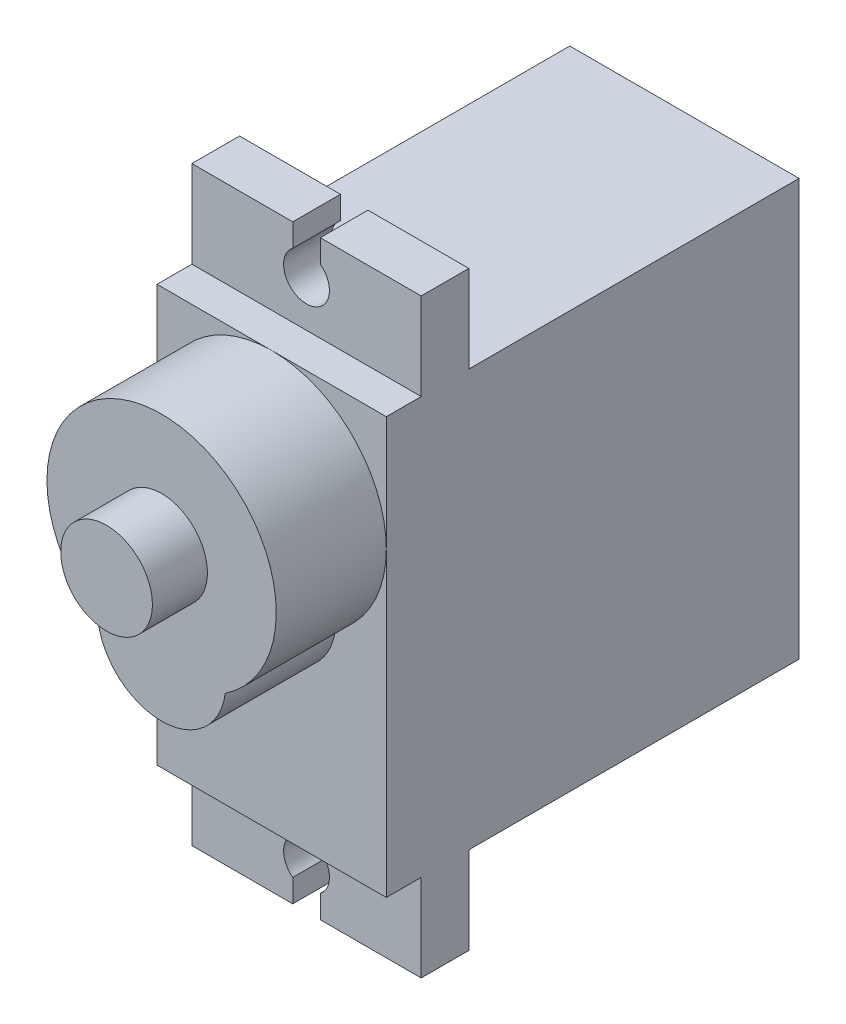
ISO-10303-21;
HEADER;
FILE_DESCRIPTION(('STEP AP214'),'2;1');
FILE_NAME('part.step','',(''),(''),'','','');
FILE_SCHEMA(('AUTOMOTIVE_DESIGN { 1 0 10303 214 1 1 1 1 }'));
ENDSEC;
DATA;
#1=APPLICATION_CONTEXT('core data for automotive mechanical design processes');
#2=APPLICATION_PROTOCOL_DEFINITION('international standard','automotive_design',2000,#1);
#3=PRODUCT_CONTEXT('',#1,'mechanical');
#4=PRODUCT('Part','Part','',(#3));
#5=PRODUCT_RELATED_PRODUCT_CATEGORY('part','',(#4));
#6=PRODUCT_DEFINITION_FORMATION('','',#4);
#7=PRODUCT_DEFINITION_CONTEXT('part definition',#1,'design');
#8=PRODUCT_DEFINITION('design','',#6,#7);
#9=PRODUCT_DEFINITION_SHAPE('','',#8);
#10=(LENGTH_UNIT() NAMED_UNIT(*) SI_UNIT(.MILLI.,.METRE.));
#11=(NAMED_UNIT(*) PLANE_ANGLE_UNIT() SI_UNIT($,.RADIAN.));
#12=(NAMED_UNIT(*) SI_UNIT($,.STERADIAN.) SOLID_ANGLE_UNIT());
#13=UNCERTAINTY_MEASURE_WITH_UNIT(LENGTH_MEASURE(1.E-05),#10,'distance_accuracy_value','');
#14=(GEOMETRIC_REPRESENTATION_CONTEXT(3) GLOBAL_UNCERTAINTY_ASSIGNED_CONTEXT((#13)) GLOBAL_UNIT_ASSIGNED_CONTEXT((#10,
#11,#12)) REPRESENTATION_CONTEXT('',''));
#15=CARTESIAN_POINT('',(0.,0.,0.));
#16=DIRECTION('',(0.,0.,1.));
#17=DIRECTION('',(1.,0.,0.));
#18=AXIS2_PLACEMENT_3D('',#15,#16,#17);
#19=CARTESIAN_POINT('',(12.5,27.45,20.6));
#20=DIRECTION('',(0.,-1.,0.));
#21=DIRECTION('',(0.,0.,-1.));
#22=AXIS2_PLACEMENT_3D('',#19,#20,#21);
#23=PLANE('',#22);
#24=DIRECTION('',(-1.,0.,0.));
#25=VECTOR('',#24,1.);
#26=CARTESIAN_POINT('',(12.5,27.45,20.6));
#27=LINE('',#26,#25);
#28=CARTESIAN_POINT('',(5.5,27.45,20.6));
#29=VERTEX_POINT('',#28);
#30=CARTESIAN_POINT('',(0.,27.45,20.6));
#31=VERTEX_POINT('',#30);
#32=EDGE_CURVE('E369',#29,#31,#27,.T.);
#33=ORIENTED_EDGE('',*,*,#32,.F.);
#34=DIRECTION('',(0.,0.,1.));
#35=VECTOR('',#34,1.);
#36=CARTESIAN_POINT('',(5.5,27.45,13.6988373664787));
#37=LINE('',#36,#35);
#38=CARTESIAN_POINT('',(5.5,27.45,18.));
#39=VERTEX_POINT('',#38);
#40=EDGE_CURVE('E234',#39,#29,#37,.T.);
#41=ORIENTED_EDGE('',*,*,#40,.F.);
#42=DIRECTION('',(-1.,0.,0.));
#43=VECTOR('',#42,1.);
#44=CARTESIAN_POINT('',(12.5,27.45,18.));
#45=LINE('',#44,#43);
#46=CARTESIAN_POINT('',(0.,27.45,18.));
#47=VERTEX_POINT('',#46);
#48=EDGE_CURVE('E371',#39,#47,#45,.T.);
#49=ORIENTED_EDGE('',*,*,#48,.T.);
#50=DIRECTION('',(0.,0.,1.));
#51=VECTOR('',#50,1.);
#52=CARTESIAN_POINT('',(0.,27.45,20.6));
#53=LINE('',#52,#51);
#54=EDGE_CURVE('E319',#47,#31,#53,.T.);
#55=ORIENTED_EDGE('',*,*,#54,.T.);
#56=EDGE_LOOP('',(#33,#41,#49,#55));
#57=FACE_BOUND('',#56,.T.);
#58=ADVANCED_FACE('F50',(#57),#23,.F.);
#59=CARTESIAN_POINT('',(12.5,-4.75,20.6));
#60=DIRECTION('',(0.,0.,-1.));
#61=DIRECTION('',(-1.,0.,0.));
#62=AXIS2_PLACEMENT_3D('',#59,#60,#61);
#63=PLANE('',#62);
#64=DIRECTION('',(0.,-1.,0.));
#65=VECTOR('',#64,1.);
#66=CARTESIAN_POINT('',(7.,0.,20.6));
#67=LINE('',#66,#65);
#68=CARTESIAN_POINT('',(7.,-3.5,20.6));
#69=VERTEX_POINT('',#68);
#70=CARTESIAN_POINT('',(7.,-4.75,20.6));
#71=VERTEX_POINT('',#70);
#72=EDGE_CURVE('E248',#69,#71,#67,.T.);
#73=ORIENTED_EDGE('',*,*,#72,.T.);
#74=DIRECTION('',(-1.,0.,0.));
#75=VECTOR('',#74,1.);
#76=CARTESIAN_POINT('',(12.5,-4.75,20.6));
#77=LINE('',#76,#75);
#78=CARTESIAN_POINT('',(12.5,-4.75,20.6));
#79=VERTEX_POINT('',#78);
#80=EDGE_CURVE('E352',#79,#71,#77,.T.);
#81=ORIENTED_EDGE('',*,*,#80,.F.);
#82=DIRECTION('',(0.,-1.,0.));
#83=VECTOR('',#82,1.);
#84=CARTESIAN_POINT('',(12.5,-4.75,20.6));
#85=LINE('',#84,#83);
#86=CARTESIAN_POINT('',(12.5,0.,20.6));
#87=VERTEX_POINT('',#86);
#88=EDGE_CURVE('E304',#87,#79,#85,.T.);
#89=ORIENTED_EDGE('',*,*,#88,.F.);
#90=DIRECTION('',(-1.,0.,0.));
#91=VECTOR('',#90,1.);
#92=CARTESIAN_POINT('',(12.5,0.,20.6));
#93=LINE('',#92,#91);
#94=CARTESIAN_POINT('',(0.,0.,20.6));
#95=VERTEX_POINT('',#94);
#96=EDGE_CURVE('E357',#87,#95,#93,.T.);
#97=ORIENTED_EDGE('',*,*,#96,.T.);
#98=DIRECTION('',(0.,-1.,0.));
#99=VECTOR('',#98,1.);
#100=CARTESIAN_POINT('',(0.,-4.75,20.6));
#101=LINE('',#100,#99);
#102=CARTESIAN_POINT('',(0.,-4.75,20.6));
#103=VERTEX_POINT('',#102);
#104=EDGE_CURVE('E331',#95,#103,#101,.T.);
#105=ORIENTED_EDGE('',*,*,#104,.T.);
#106=CARTESIAN_POINT('',(5.5,-4.75,20.6));
#107=VERTEX_POINT('',#106);
#108=EDGE_CURVE('E355',#107,#103,#77,.T.);
#109=ORIENTED_EDGE('',*,*,#108,.F.);
#110=DIRECTION('',(0.,-1.,0.));
#111=VECTOR('',#110,1.);
#112=CARTESIAN_POINT('',(5.5,0.,20.6));
#113=LINE('',#112,#111);
#114=CARTESIAN_POINT('',(5.5,-3.5,20.6));
#115=VERTEX_POINT('',#114);
#116=EDGE_CURVE('E251',#115,#107,#113,.T.);
#117=ORIENTED_EDGE('',*,*,#116,.F.);
#118=CARTESIAN_POINT('',(6.25,-2.5,20.6));
#119=DIRECTION('',(0.,0.,1.));
#120=DIRECTION('',(1.,0.,0.));
#121=AXIS2_PLACEMENT_3D('',#118,#119,#120);
#122=CIRCLE('',#121,1.25);
#123=EDGE_CURVE('E253',#69,#115,#122,.T.);
#124=ORIENTED_EDGE('',*,*,#123,.F.);
#125=EDGE_LOOP('',(#73,#81,#89,#97,#105,#109,#117,#124));
#126=FACE_BOUND('',#125,.T.);
#127=ADVANCED_FACE('F422',(#126),#63,.F.);
#128=CARTESIAN_POINT('',(12.5,-4.75,18.));
#129=DIRECTION('',(0.,1.,0.));
#130=DIRECTION('',(0.,0.,1.));
#131=AXIS2_PLACEMENT_3D('',#128,#129,#130);
#132=PLANE('',#131);
#133=DIRECTION('',(0.,0.,1.));
#134=VECTOR('',#133,1.);
#135=CARTESIAN_POINT('',(7.,-4.75,13.6988373664787));
#136=LINE('',#135,#134);
#137=CARTESIAN_POINT('',(7.,-4.75,18.));
#138=VERTEX_POINT('',#137);
#139=EDGE_CURVE('E243',#138,#71,#136,.T.);
#140=ORIENTED_EDGE('',*,*,#139,.F.);
#141=DIRECTION('',(-1.,0.,0.));
#142=VECTOR('',#141,1.);
#143=CARTESIAN_POINT('',(12.5,-4.75,18.));
#144=LINE('',#143,#142);
#145=CARTESIAN_POINT('',(12.5,-4.75,18.));
#146=VERTEX_POINT('',#145);
#147=EDGE_CURVE('E349',#146,#138,#144,.T.);
#148=ORIENTED_EDGE('',*,*,#147,.F.);
#149=DIRECTION('',(0.,0.,-1.));
#150=VECTOR('',#149,1.);
#151=CARTESIAN_POINT('',(12.5,-4.75,18.));
#152=LINE('',#151,#150);
#153=EDGE_CURVE('E308',#79,#146,#152,.T.);
#154=ORIENTED_EDGE('',*,*,#153,.F.);
#155=ORIENTED_EDGE('',*,*,#80,.T.);
#156=EDGE_LOOP('',(#140,#148,#154,#155));
#157=FACE_BOUND('',#156,.T.);
#158=ADVANCED_FACE('F429',(#157),#132,.F.);
#159=CARTESIAN_POINT('',(12.5,0.,18.));
#160=DIRECTION('',(0.,0.,1.));
#161=DIRECTION('',(0.,-1.,0.));
#162=AXIS2_PLACEMENT_3D('',#159,#160,#161);
#163=PLANE('',#162);
#164=DIRECTION('',(0.,1.,0.));
#165=VECTOR('',#164,1.);
#166=CARTESIAN_POINT('',(7.,0.,18.));
#167=LINE('',#166,#165);
#168=CARTESIAN_POINT('',(7.,-3.5,18.));
#169=VERTEX_POINT('',#168);
#170=EDGE_CURVE('E242',#138,#169,#167,.T.);
#171=ORIENTED_EDGE('',*,*,#170,.T.);
#172=CARTESIAN_POINT('',(6.25,-2.5,18.));
#173=DIRECTION('',(0.,0.,1.));
#174=DIRECTION('',(1.,0.,0.));
#175=AXIS2_PLACEMENT_3D('',#172,#173,#174);
#176=CIRCLE('',#175,1.25);
#177=CARTESIAN_POINT('',(5.5,-3.5,18.));
#178=VERTEX_POINT('',#177);
#179=EDGE_CURVE('E250',#178,#169,#176,.F.);
#180=ORIENTED_EDGE('',*,*,#179,.F.);
#181=DIRECTION('',(0.,1.,0.));
#182=VECTOR('',#181,1.);
#183=CARTESIAN_POINT('',(5.5,0.,18.));
#184=LINE('',#183,#182);
#185=CARTESIAN_POINT('',(5.5,-4.75,18.));
#186=VERTEX_POINT('',#185);
#187=EDGE_CURVE('E241',#186,#178,#184,.T.);
#188=ORIENTED_EDGE('',*,*,#187,.F.);
#189=CARTESIAN_POINT('',(0.,-4.75,18.));
#190=VERTEX_POINT('',#189);
#191=EDGE_CURVE('E346',#186,#190,#144,.T.);
#192=ORIENTED_EDGE('',*,*,#191,.T.);
#193=DIRECTION('',(0.,1.,0.));
#194=VECTOR('',#193,1.);
#195=CARTESIAN_POINT('',(0.,0.,18.));
#196=LINE('',#195,#194);
#197=CARTESIAN_POINT('',(0.,0.,18.));
#198=VERTEX_POINT('',#197);
#199=EDGE_CURVE('E339',#190,#198,#196,.T.);
#200=ORIENTED_EDGE('',*,*,#199,.T.);
#201=DIRECTION('',(-1.,0.,0.));
#202=VECTOR('',#201,1.);
#203=CARTESIAN_POINT('',(12.5,0.,18.));
#204=LINE('',#203,#202);
#205=CARTESIAN_POINT('',(12.5,0.,18.));
#206=VERTEX_POINT('',#205);
#207=EDGE_CURVE('E341',#206,#198,#204,.T.);
#208=ORIENTED_EDGE('',*,*,#207,.F.);
#209=DIRECTION('',(0.,1.,0.));
#210=VECTOR('',#209,1.);
#211=CARTESIAN_POINT('',(12.5,0.,18.));
#212=LINE('',#211,#210);
#213=EDGE_CURVE('E306',#146,#206,#212,.T.);
#214=ORIENTED_EDGE('',*,*,#213,.F.);
#215=ORIENTED_EDGE('',*,*,#147,.T.);
#216=EDGE_LOOP('',(#171,#180,#188,#192,#200,#208,#214,#215));
#217=FACE_BOUND('',#216,.T.);
#218=ADVANCED_FACE('F432',(#217),#163,.F.);
#219=CARTESIAN_POINT('',(12.5,0.,22.5));
#220=DIRECTION('',(0.,0.,-1.));
#221=DIRECTION('',(-1.,0.,0.));
#222=AXIS2_PLACEMENT_3D('',#219,#220,#221);
#223=PLANE('',#222);
#224=CARTESIAN_POINT('',(6.25,11.7,22.5));
#225=DIRECTION('',(0.,0.,1.));
#226=DIRECTION('',(1.,0.,0.));
#227=AXIS2_PLACEMENT_3D('',#224,#225,#226);
#228=CIRCLE('',#227,3.5);
#229=CARTESIAN_POINT('',(2.77870895834923,11.2526315789474,22.5));
#230=VERTEX_POINT('',#229);
#231=CARTESIAN_POINT('',(9.72129104165077,11.2526315789474,22.5));
#232=VERTEX_POINT('',#231);
#233=EDGE_CURVE('E262',#230,#232,#228,.T.);
#234=ORIENTED_EDGE('',*,*,#233,.F.);
#235=CARTESIAN_POINT('',(6.25,16.45,22.5));
#236=DIRECTION('',(0.,0.,1.));
#237=DIRECTION('',(1.,0.,0.));
#238=AXIS2_PLACEMENT_3D('',#235,#236,#237);
#239=CIRCLE('',#238,6.25);
#240=CARTESIAN_POINT('',(0.,16.45,22.5));
#241=VERTEX_POINT('',#240);
#242=EDGE_CURVE('E280',#241,#230,#239,.T.);
#243=ORIENTED_EDGE('',*,*,#242,.F.);
#244=DIRECTION('',(0.,-1.,0.));
#245=VECTOR('',#244,1.);
#246=CARTESIAN_POINT('',(0.,0.,22.5));
#247=LINE('',#246,#245);
#248=CARTESIAN_POINT('',(0.,0.,22.5));
#249=VERTEX_POINT('',#248);
#250=EDGE_CURVE('E327',#241,#249,#247,.T.);
#251=ORIENTED_EDGE('',*,*,#250,.T.);
#252=DIRECTION('',(-1.,0.,0.));
#253=VECTOR('',#252,1.);
#254=CARTESIAN_POINT('',(12.5,0.,22.5));
#255=LINE('',#254,#253);
#256=CARTESIAN_POINT('',(12.5,0.,22.5));
#257=VERTEX_POINT('',#256);
#258=EDGE_CURVE('E359',#257,#249,#255,.T.);
#259=ORIENTED_EDGE('',*,*,#258,.F.);
#260=DIRECTION('',(0.,-1.,0.));
#261=VECTOR('',#260,1.);
#262=CARTESIAN_POINT('',(12.5,0.,22.5));
#263=LINE('',#262,#261);
#264=CARTESIAN_POINT('',(12.5,16.45,22.5));
#265=VERTEX_POINT('',#264);
#266=EDGE_CURVE('E297',#265,#257,#263,.T.);
#267=ORIENTED_EDGE('',*,*,#266,.F.);
#268=EDGE_CURVE('E269',#232,#265,#239,.T.);
#269=ORIENTED_EDGE('',*,*,#268,.F.);
#270=EDGE_LOOP('',(#234,#243,#251,#259,#267,#269));
#271=FACE_BOUND('',#270,.T.);
#272=ADVANCED_FACE('F400',(#271),#223,.F.);
#273=CARTESIAN_POINT('',(6.25,22.7,22.5));
#274=VERTEX_POINT('',#273);
#275=EDGE_CURVE('E57',#265,#274,#239,.T.);
#276=ORIENTED_EDGE('',*,*,#275,.F.);
#277=CARTESIAN_POINT('',(12.5,22.7,22.5));
#278=VERTEX_POINT('',#277);
#279=EDGE_CURVE('E298',#278,#265,#263,.T.);
#280=ORIENTED_EDGE('',*,*,#279,.F.);
#281=DIRECTION('',(-1.,0.,0.));
#282=VECTOR('',#281,1.);
#283=CARTESIAN_POINT('',(12.5,22.7,22.5));
#284=LINE('',#283,#282);
#285=EDGE_CURVE('E361',#278,#274,#284,.T.);
#286=ORIENTED_EDGE('',*,*,#285,.T.);
#287=EDGE_LOOP('',(#276,#280,#286));
#288=FACE_BOUND('',#287,.T.);
#289=ADVANCED_FACE('F392',(#288),#223,.F.);
#290=CARTESIAN_POINT('',(12.5,22.7,0.));
#291=DIRECTION('',(0.,0.,1.));
#292=DIRECTION('',(1.,0.,0.));
#293=AXIS2_PLACEMENT_3D('',#290,#291,#292);
#294=PLANE('',#293);
#295=DIRECTION('',(0.,1.,0.));
#296=VECTOR('',#295,1.);
#297=CARTESIAN_POINT('',(0.,22.7,0.));
#298=LINE('',#297,#296);
#299=CARTESIAN_POINT('',(0.,0.,0.));
#300=VERTEX_POINT('',#299);
#301=CARTESIAN_POINT('',(0.,22.7,0.));
#302=VERTEX_POINT('',#301);
#303=EDGE_CURVE('E282',#300,#302,#298,.T.);
#304=ORIENTED_EDGE('',*,*,#303,.T.);
#305=DIRECTION('',(-1.,0.,0.));
#306=VECTOR('',#305,1.);
#307=CARTESIAN_POINT('',(12.5,22.7,0.));
#308=LINE('',#307,#306);
#309=CARTESIAN_POINT('',(12.5,22.7,0.));
#310=VERTEX_POINT('',#309);
#311=EDGE_CURVE('E51',#310,#302,#308,.T.);
#312=ORIENTED_EDGE('',*,*,#311,.F.);
#313=DIRECTION('',(0.,1.,0.));
#314=VECTOR('',#313,1.);
#315=CARTESIAN_POINT('',(12.5,22.7,0.));
#316=LINE('',#315,#314);
#317=CARTESIAN_POINT('',(12.5,0.,0.));
#318=VERTEX_POINT('',#317);
#319=EDGE_CURVE('E283',#318,#310,#316,.T.);
#320=ORIENTED_EDGE('',*,*,#319,.F.);
#321=DIRECTION('',(-1.,0.,0.));
#322=VECTOR('',#321,1.);
#323=CARTESIAN_POINT('',(12.5,0.,0.));
#324=LINE('',#323,#322);
#325=EDGE_CURVE('E315',#318,#300,#324,.T.);
#326=ORIENTED_EDGE('',*,*,#325,.T.);
#327=EDGE_LOOP('',(#304,#312,#320,#326));
#328=FACE_BOUND('',#327,.T.);
#329=ADVANCED_FACE('F47',(#328),#294,.F.);
#330=CARTESIAN_POINT('',(12.5,22.7,18.));
#331=DIRECTION('',(0.,-1.,0.));
#332=DIRECTION('',(0.,0.,-1.));
#333=AXIS2_PLACEMENT_3D('',#330,#331,#332);
#334=PLANE('',#333);
#335=DIRECTION('',(0.,0.,1.));
#336=VECTOR('',#335,1.);
#337=CARTESIAN_POINT('',(0.,22.7,18.));
#338=LINE('',#337,#336);
#339=CARTESIAN_POINT('',(0.,22.7,18.));
#340=VERTEX_POINT('',#339);
#341=EDGE_CURVE('E312',#302,#340,#338,.T.);
#342=ORIENTED_EDGE('',*,*,#341,.T.);
#343=DIRECTION('',(-1.,0.,0.));
#344=VECTOR('',#343,1.);
#345=CARTESIAN_POINT('',(12.5,22.7,18.));
#346=LINE('',#345,#344);
#347=CARTESIAN_POINT('',(12.5,22.7,18.));
#348=VERTEX_POINT('',#347);
#349=EDGE_CURVE('E372',#348,#340,#346,.T.);
#350=ORIENTED_EDGE('',*,*,#349,.F.);
#351=DIRECTION('',(0.,0.,1.));
#352=VECTOR('',#351,1.);
#353=CARTESIAN_POINT('',(12.5,22.7,18.));
#354=LINE('',#353,#352);
#355=EDGE_CURVE('E290',#310,#348,#354,.T.);
#356=ORIENTED_EDGE('',*,*,#355,.F.);
#357=ORIENTED_EDGE('',*,*,#311,.T.);
#358=EDGE_LOOP('',(#342,#350,#356,#357));
#359=FACE_BOUND('',#358,.T.);
#360=ADVANCED_FACE('F441',(#359),#334,.F.);
#361=CARTESIAN_POINT('',(12.5,27.45,18.));
#362=DIRECTION('',(0.,0.,1.));
#363=DIRECTION('',(1.,0.,0.));
#364=AXIS2_PLACEMENT_3D('',#361,#362,#363);
#365=PLANE('',#364);
#366=ORIENTED_EDGE('',*,*,#48,.F.);
#367=DIRECTION('',(0.,1.,0.));
#368=VECTOR('',#367,1.);
#369=CARTESIAN_POINT('',(5.5,0.,18.));
#370=LINE('',#369,#368);
#371=CARTESIAN_POINT('',(5.5,26.2,18.));
#372=VERTEX_POINT('',#371);
#373=EDGE_CURVE('E238',#372,#39,#370,.T.);
#374=ORIENTED_EDGE('',*,*,#373,.F.);
#375=CARTESIAN_POINT('',(6.25,25.2,18.));
#376=DIRECTION('',(0.,0.,1.));
#377=DIRECTION('',(1.,0.,0.));
#378=AXIS2_PLACEMENT_3D('',#375,#376,#377);
#379=CIRCLE('',#378,1.25);
#380=CARTESIAN_POINT('',(7.,26.2,18.));
#381=VERTEX_POINT('',#380);
#382=EDGE_CURVE('E240',#381,#372,#379,.F.);
#383=ORIENTED_EDGE('',*,*,#382,.F.);
#384=DIRECTION('',(0.,-1.,0.));
#385=VECTOR('',#384,1.);
#386=CARTESIAN_POINT('',(6.99999999999998,0.,18.));
#387=LINE('',#386,#385);
#388=CARTESIAN_POINT('',(7.,27.45,18.));
#389=VERTEX_POINT('',#388);
#390=EDGE_CURVE('E212',#389,#381,#387,.T.);
#391=ORIENTED_EDGE('',*,*,#390,.F.);
#392=CARTESIAN_POINT('',(12.5,27.45,18.));
#393=VERTEX_POINT('',#392);
#394=EDGE_CURVE('E375',#393,#389,#45,.T.);
#395=ORIENTED_EDGE('',*,*,#394,.F.);
#396=DIRECTION('',(0.,1.,0.));
#397=VECTOR('',#396,1.);
#398=CARTESIAN_POINT('',(12.5,27.45,18.));
#399=LINE('',#398,#397);
#400=EDGE_CURVE('E286',#348,#393,#399,.T.);
#401=ORIENTED_EDGE('',*,*,#400,.F.);
#402=ORIENTED_EDGE('',*,*,#349,.T.);
#403=DIRECTION('',(0.,1.,0.));
#404=VECTOR('',#403,1.);
#405=CARTESIAN_POINT('',(0.,27.45,18.));
#406=LINE('',#405,#404);
#407=EDGE_CURVE('E320',#340,#47,#406,.T.);
#408=ORIENTED_EDGE('',*,*,#407,.T.);
#409=EDGE_LOOP('',(#366,#374,#383,#391,#395,#401,#402,#408));
#410=FACE_BOUND('',#409,.T.);
#411=ADVANCED_FACE('F450',(#410),#365,.F.);
#412=ORIENTED_EDGE('',*,*,#394,.T.);
#413=DIRECTION('',(0.,0.,1.));
#414=VECTOR('',#413,1.);
#415=CARTESIAN_POINT('',(7.,27.45,13.6988373664787));
#416=LINE('',#415,#414);
#417=CARTESIAN_POINT('',(7.,27.45,20.6));
#418=VERTEX_POINT('',#417);
#419=EDGE_CURVE('E220',#389,#418,#416,.T.);
#420=ORIENTED_EDGE('',*,*,#419,.T.);
#421=CARTESIAN_POINT('',(12.5,27.45,20.6));
#422=VERTEX_POINT('',#421);
#423=EDGE_CURVE('E228',#422,#418,#27,.T.);
#424=ORIENTED_EDGE('',*,*,#423,.F.);
#425=DIRECTION('',(0.,0.,1.));
#426=VECTOR('',#425,1.);
#427=CARTESIAN_POINT('',(12.5,27.45,20.6));
#428=LINE('',#427,#426);
#429=EDGE_CURVE('E295',#393,#422,#428,.T.);
#430=ORIENTED_EDGE('',*,*,#429,.F.);
#431=EDGE_LOOP('',(#412,#420,#424,#430));
#432=FACE_BOUND('',#431,.T.);
#433=ADVANCED_FACE('F449',(#432),#23,.F.);
#434=CARTESIAN_POINT('',(12.5,22.7,20.6));
#435=DIRECTION('',(0.,0.,-1.));
#436=DIRECTION('',(-1.,0.,0.));
#437=AXIS2_PLACEMENT_3D('',#434,#435,#436);
#438=PLANE('',#437);
#439=CARTESIAN_POINT('',(6.25,25.2,20.6));
#440=DIRECTION('',(0.,0.,1.));
#441=DIRECTION('',(1.,0.,0.));
#442=AXIS2_PLACEMENT_3D('',#439,#440,#441);
#443=CIRCLE('',#442,1.25);
#444=CARTESIAN_POINT('',(5.5,26.2,20.6));
#445=VERTEX_POINT('',#444);
#446=CARTESIAN_POINT('',(7.,26.2,20.6));
#447=VERTEX_POINT('',#446);
#448=EDGE_CURVE('E222',#445,#447,#443,.T.);
#449=ORIENTED_EDGE('',*,*,#448,.F.);
#450=DIRECTION('',(0.,-1.,0.));
#451=VECTOR('',#450,1.);
#452=CARTESIAN_POINT('',(5.5,0.,20.6));
#453=LINE('',#452,#451);
#454=EDGE_CURVE('E63',#29,#445,#453,.T.);
#455=ORIENTED_EDGE('',*,*,#454,.F.);
#456=ORIENTED_EDGE('',*,*,#32,.T.);
#457=DIRECTION('',(0.,-1.,0.));
#458=VECTOR('',#457,1.);
#459=CARTESIAN_POINT('',(0.,22.7,20.6));
#460=LINE('',#459,#458);
#461=CARTESIAN_POINT('',(0.,22.7,20.6));
#462=VERTEX_POINT('',#461);
#463=EDGE_CURVE('E323',#31,#462,#460,.T.);
#464=ORIENTED_EDGE('',*,*,#463,.T.);
#465=DIRECTION('',(-1.,0.,0.));
#466=VECTOR('',#465,1.);
#467=CARTESIAN_POINT('',(12.5,22.7,20.6));
#468=LINE('',#467,#466);
#469=CARTESIAN_POINT('',(12.5,22.7,20.6));
#470=VERTEX_POINT('',#469);
#471=EDGE_CURVE('E368',#470,#462,#468,.T.);
#472=ORIENTED_EDGE('',*,*,#471,.F.);
#473=DIRECTION('',(0.,-1.,0.));
#474=VECTOR('',#473,1.);
#475=CARTESIAN_POINT('',(12.5,22.7,20.6));
#476=LINE('',#475,#474);
#477=EDGE_CURVE('E294',#422,#470,#476,.T.);
#478=ORIENTED_EDGE('',*,*,#477,.F.);
#479=ORIENTED_EDGE('',*,*,#423,.T.);
#480=DIRECTION('',(0.,1.,0.));
#481=VECTOR('',#480,1.);
#482=CARTESIAN_POINT('',(6.99999999999998,0.,20.6));
#483=LINE('',#482,#481);
#484=EDGE_CURVE('E211',#447,#418,#483,.T.);
#485=ORIENTED_EDGE('',*,*,#484,.F.);
#486=EDGE_LOOP('',(#449,#455,#456,#464,#472,#478,#479,#485));
#487=FACE_BOUND('',#486,.T.);
#488=ADVANCED_FACE('F226',(#487),#438,.F.);
#489=CARTESIAN_POINT('',(12.5,22.7,22.5));
#490=DIRECTION('',(0.,-1.,0.));
#491=DIRECTION('',(0.,0.,-1.));
#492=AXIS2_PLACEMENT_3D('',#489,#490,#491);
#493=PLANE('',#492);
#494=DIRECTION('',(0.,0.,1.));
#495=VECTOR('',#494,1.);
#496=CARTESIAN_POINT('',(0.,22.7,22.5));
#497=LINE('',#496,#495);
#498=CARTESIAN_POINT('',(0.,22.7,22.5));
#499=VERTEX_POINT('',#498);
#500=EDGE_CURVE('E324',#462,#499,#497,.T.);
#501=ORIENTED_EDGE('',*,*,#500,.T.);
#502=EDGE_CURVE('E362',#274,#499,#284,.T.);
#503=ORIENTED_EDGE('',*,*,#502,.F.);
#504=ORIENTED_EDGE('',*,*,#285,.F.);
#505=DIRECTION('',(0.,0.,1.));
#506=VECTOR('',#505,1.);
#507=CARTESIAN_POINT('',(12.5,22.7,22.5));
#508=LINE('',#507,#506);
#509=EDGE_CURVE('E296',#470,#278,#508,.T.);
#510=ORIENTED_EDGE('',*,*,#509,.F.);
#511=ORIENTED_EDGE('',*,*,#471,.T.);
#512=EDGE_LOOP('',(#501,#503,#504,#510,#511));
#513=FACE_BOUND('',#512,.T.);
#514=ADVANCED_FACE('F403',(#513),#493,.F.);
#515=EDGE_CURVE('E383',#274,#241,#239,.T.);
#516=ORIENTED_EDGE('',*,*,#515,.F.);
#517=ORIENTED_EDGE('',*,*,#502,.T.);
#518=EDGE_CURVE('E328',#499,#241,#247,.T.);
#519=ORIENTED_EDGE('',*,*,#518,.T.);
#520=EDGE_LOOP('',(#516,#517,#519));
#521=FACE_BOUND('',#520,.T.);
#522=ADVANCED_FACE('F408',(#521),#223,.F.);
#523=CARTESIAN_POINT('',(12.5,0.,20.6));
#524=DIRECTION('',(0.,1.,0.));
#525=DIRECTION('',(0.,0.,1.));
#526=AXIS2_PLACEMENT_3D('',#523,#524,#525);
#527=PLANE('',#526);
#528=DIRECTION('',(0.,0.,-1.));
#529=VECTOR('',#528,1.);
#530=CARTESIAN_POINT('',(0.,0.,20.6));
#531=LINE('',#530,#529);
#532=EDGE_CURVE('E335',#249,#95,#531,.T.);
#533=ORIENTED_EDGE('',*,*,#532,.T.);
#534=ORIENTED_EDGE('',*,*,#96,.F.);
#535=DIRECTION('',(0.,0.,-1.));
#536=VECTOR('',#535,1.);
#537=CARTESIAN_POINT('',(12.5,0.,20.6));
#538=LINE('',#537,#536);
#539=EDGE_CURVE('E305',#257,#87,#538,.T.);
#540=ORIENTED_EDGE('',*,*,#539,.F.);
#541=ORIENTED_EDGE('',*,*,#258,.T.);
#542=EDGE_LOOP('',(#533,#534,#540,#541));
#543=FACE_BOUND('',#542,.T.);
#544=ADVANCED_FACE('F416',(#543),#527,.F.);
#545=ORIENTED_EDGE('',*,*,#191,.F.);
#546=DIRECTION('',(0.,0.,1.));
#547=VECTOR('',#546,1.);
#548=CARTESIAN_POINT('',(5.5,-4.75,13.6988373664787));
#549=LINE('',#548,#547);
#550=EDGE_CURVE('E260',#186,#107,#549,.T.);
#551=ORIENTED_EDGE('',*,*,#550,.T.);
#552=ORIENTED_EDGE('',*,*,#108,.T.);
#553=DIRECTION('',(0.,0.,-1.));
#554=VECTOR('',#553,1.);
#555=CARTESIAN_POINT('',(0.,-4.75,18.));
#556=LINE('',#555,#554);
#557=EDGE_CURVE('E340',#103,#190,#556,.T.);
#558=ORIENTED_EDGE('',*,*,#557,.T.);
#559=EDGE_LOOP('',(#545,#551,#552,#558));
#560=FACE_BOUND('',#559,.T.);
#561=ADVANCED_FACE('F502',(#560),#132,.F.);
#562=CARTESIAN_POINT('',(12.5,0.,0.));
#563=DIRECTION('',(0.,1.,0.));
#564=DIRECTION('',(0.,0.,1.));
#565=AXIS2_PLACEMENT_3D('',#562,#563,#564);
#566=PLANE('',#565);
#567=DIRECTION('',(0.,0.,-1.));
#568=VECTOR('',#567,1.);
#569=CARTESIAN_POINT('',(0.,0.,0.));
#570=LINE('',#569,#568);
#571=EDGE_CURVE('E288',#198,#300,#570,.T.);
#572=ORIENTED_EDGE('',*,*,#571,.T.);
#573=ORIENTED_EDGE('',*,*,#325,.F.);
#574=DIRECTION('',(0.,0.,-1.));
#575=VECTOR('',#574,1.);
#576=CARTESIAN_POINT('',(12.5,0.,0.));
#577=LINE('',#576,#575);
#578=EDGE_CURVE('E309',#206,#318,#577,.T.);
#579=ORIENTED_EDGE('',*,*,#578,.F.);
#580=ORIENTED_EDGE('',*,*,#207,.T.);
#581=EDGE_LOOP('',(#572,#573,#579,#580));
#582=FACE_BOUND('',#581,.T.);
#583=ADVANCED_FACE('F438',(#582),#566,.F.);
#584=CARTESIAN_POINT('',(12.5,0.,0.));
#585=DIRECTION('',(-1.,0.,0.));
#586=DIRECTION('',(0.,0.,1.));
#587=AXIS2_PLACEMENT_3D('',#584,#585,#586);
#588=PLANE('',#587);
#589=ORIENTED_EDGE('',*,*,#319,.T.);
#590=ORIENTED_EDGE('',*,*,#355,.T.);
#591=ORIENTED_EDGE('',*,*,#400,.T.);
#592=ORIENTED_EDGE('',*,*,#429,.T.);
#593=ORIENTED_EDGE('',*,*,#477,.T.);
#594=ORIENTED_EDGE('',*,*,#509,.T.);
#595=ORIENTED_EDGE('',*,*,#279,.T.);
#596=ORIENTED_EDGE('',*,*,#266,.T.);
#597=ORIENTED_EDGE('',*,*,#539,.T.);
#598=ORIENTED_EDGE('',*,*,#88,.T.);
#599=ORIENTED_EDGE('',*,*,#153,.T.);
#600=ORIENTED_EDGE('',*,*,#213,.T.);
#601=ORIENTED_EDGE('',*,*,#578,.T.);
#602=EDGE_LOOP('',(#589,#590,#591,#592,#593,#594,#595,#596,#597,#598,#599,#600,#601));
#603=FACE_BOUND('',#602,.T.);
#604=ADVANCED_FACE('F396',(#603),#588,.F.);
#605=CARTESIAN_POINT('',(0.,0.,0.));
#606=DIRECTION('',(-1.,0.,0.));
#607=DIRECTION('',(0.,0.,1.));
#608=AXIS2_PLACEMENT_3D('',#605,#606,#607);
#609=PLANE('',#608);
#610=ORIENTED_EDGE('',*,*,#303,.F.);
#611=ORIENTED_EDGE('',*,*,#571,.F.);
#612=ORIENTED_EDGE('',*,*,#199,.F.);
#613=ORIENTED_EDGE('',*,*,#557,.F.);
#614=ORIENTED_EDGE('',*,*,#104,.F.);
#615=ORIENTED_EDGE('',*,*,#532,.F.);
#616=ORIENTED_EDGE('',*,*,#250,.F.);
#617=ORIENTED_EDGE('',*,*,#518,.F.);
#618=ORIENTED_EDGE('',*,*,#500,.F.);
#619=ORIENTED_EDGE('',*,*,#463,.F.);
#620=ORIENTED_EDGE('',*,*,#54,.F.);
#621=ORIENTED_EDGE('',*,*,#407,.F.);
#622=ORIENTED_EDGE('',*,*,#341,.F.);
#623=EDGE_LOOP('',(#610,#611,#612,#613,#614,#615,#616,#617,#618,#619,#620,#621,#622));
#624=FACE_BOUND('',#623,.T.);
#625=ADVANCED_FACE('F413',(#624),#609,.T.);
#626=CARTESIAN_POINT('',(6.25,11.7,28.5));
#627=DIRECTION('',(0.,0.,-1.));
#628=DIRECTION('',(-1.,0.,0.));
#629=AXIS2_PLACEMENT_3D('',#626,#627,#628);
#630=CYLINDRICAL_SURFACE('',#629,3.5);
#631=ORIENTED_EDGE('',*,*,#233,.T.);
#632=DIRECTION('',(0.,0.,-1.));
#633=VECTOR('',#632,1.);
#634=CARTESIAN_POINT('',(9.72129104165077,11.2526315789474,28.5));
#635=LINE('',#634,#633);
#636=CARTESIAN_POINT('',(9.72129104165077,11.2526315789474,28.5));
#637=VERTEX_POINT('',#636);
#638=EDGE_CURVE('E278',#637,#232,#635,.T.);
#639=ORIENTED_EDGE('',*,*,#638,.F.);
#640=CARTESIAN_POINT('',(6.25,11.7,28.5));
#641=DIRECTION('',(0.,0.,1.));
#642=DIRECTION('',(1.,0.,0.));
#643=AXIS2_PLACEMENT_3D('',#640,#641,#642);
#644=CIRCLE('',#643,3.5);
#645=CARTESIAN_POINT('',(2.77870895834923,11.2526315789474,28.5));
#646=VERTEX_POINT('',#645);
#647=EDGE_CURVE('E266',#646,#637,#644,.T.);
#648=ORIENTED_EDGE('',*,*,#647,.F.);
#649=DIRECTION('',(0.,0.,-1.));
#650=VECTOR('',#649,1.);
#651=CARTESIAN_POINT('',(2.77870895834923,11.2526315789474,28.5));
#652=LINE('',#651,#650);
#653=EDGE_CURVE('E275',#646,#230,#652,.T.);
#654=ORIENTED_EDGE('',*,*,#653,.T.);
#655=EDGE_LOOP('',(#631,#639,#648,#654));
#656=FACE_BOUND('',#655,.T.);
#657=ADVANCED_FACE('F617',(#656),#630,.T.);
#658=CARTESIAN_POINT('',(6.25,16.45,28.5));
#659=DIRECTION('',(0.,0.,-1.));
#660=DIRECTION('',(-1.,0.,0.));
#661=AXIS2_PLACEMENT_3D('',#658,#659,#660);
#662=CYLINDRICAL_SURFACE('',#661,6.25);
#663=ORIENTED_EDGE('',*,*,#268,.T.);
#664=ORIENTED_EDGE('',*,*,#275,.T.);
#665=ORIENTED_EDGE('',*,*,#515,.T.);
#666=ORIENTED_EDGE('',*,*,#242,.T.);
#667=ORIENTED_EDGE('',*,*,#653,.F.);
#668=CARTESIAN_POINT('',(6.25,16.45,28.5));
#669=DIRECTION('',(0.,0.,1.));
#670=DIRECTION('',(1.,0.,0.));
#671=AXIS2_PLACEMENT_3D('',#668,#669,#670);
#672=CIRCLE('',#671,6.25);
#673=EDGE_CURVE('E267',#637,#646,#672,.T.);
#674=ORIENTED_EDGE('',*,*,#673,.F.);
#675=ORIENTED_EDGE('',*,*,#638,.T.);
#676=EDGE_LOOP('',(#663,#664,#665,#666,#667,#674,#675));
#677=FACE_BOUND('',#676,.T.);
#678=ADVANCED_FACE('F386',(#677),#662,.T.);
#679=CARTESIAN_POINT('',(0.,0.,28.5));
#680=DIRECTION('',(0.,0.,1.));
#681=DIRECTION('',(1.,0.,0.));
#682=AXIS2_PLACEMENT_3D('',#679,#680,#681);
#683=PLANE('',#682);
#684=CARTESIAN_POINT('',(6.25,16.45,28.5));
#685=DIRECTION('',(0.,0.,1.));
#686=DIRECTION('',(1.,0.,0.));
#687=AXIS2_PLACEMENT_3D('',#684,#685,#686);
#688=CIRCLE('',#687,2.5);
#689=CARTESIAN_POINT('',(8.75,16.45,28.5));
#690=VERTEX_POINT('',#689);
#691=EDGE_CURVE('E11',#690,#690,#688,.T.);
#692=ORIENTED_EDGE('',*,*,#691,.F.);
#693=EDGE_LOOP('',(#692));
#694=FACE_BOUND('',#693,.T.);
#695=ORIENTED_EDGE('',*,*,#647,.T.);
#696=ORIENTED_EDGE('',*,*,#673,.T.);
#697=EDGE_LOOP('',(#695,#696));
#698=FACE_BOUND('',#697,.T.);
#699=ADVANCED_FACE('F593',(#694,#698),#683,.T.);
#700=CARTESIAN_POINT('',(6.25,16.45,31.5));
#701=DIRECTION('',(0.,0.,-1.));
#702=DIRECTION('',(-1.,0.,0.));
#703=AXIS2_PLACEMENT_3D('',#700,#701,#702);
#704=CYLINDRICAL_SURFACE('',#703,2.5);
#705=CARTESIAN_POINT('',(6.25,16.45,31.5));
#706=DIRECTION('',(0.,0.,1.));
#707=DIRECTION('',(1.,0.,0.));
#708=AXIS2_PLACEMENT_3D('',#705,#706,#707);
#709=CIRCLE('',#708,2.5);
#710=CARTESIAN_POINT('',(8.75,16.45,31.5));
#711=VERTEX_POINT('',#710);
#712=EDGE_CURVE('E239',#711,#711,#709,.T.);
#713=ORIENTED_EDGE('',*,*,#712,.F.);
#714=EDGE_LOOP('',(#713));
#715=FACE_BOUND('',#714,.T.);
#716=ORIENTED_EDGE('',*,*,#691,.T.);
#717=EDGE_LOOP('',(#716));
#718=FACE_BOUND('',#717,.T.);
#719=ADVANCED_FACE('F576',(#715,#718),#704,.T.);
#720=CARTESIAN_POINT('',(6.25,16.45,31.5));
#721=DIRECTION('',(0.,0.,1.));
#722=DIRECTION('',(1.,0.,0.));
#723=AXIS2_PLACEMENT_3D('',#720,#721,#722);
#724=PLANE('',#723);
#725=ORIENTED_EDGE('',*,*,#712,.T.);
#726=EDGE_LOOP('',(#725));
#727=FACE_BOUND('',#726,.T.);
#728=ADVANCED_FACE('F572',(#727),#724,.T.);
#729=CARTESIAN_POINT('',(7.,0.,13.6988373664787));
#730=DIRECTION('',(-1.,0.,0.));
#731=DIRECTION('',(0.,0.,1.));
#732=AXIS2_PLACEMENT_3D('',#729,#730,#731);
#733=PLANE('',#732);
#734=ORIENTED_EDGE('',*,*,#139,.T.);
#735=ORIENTED_EDGE('',*,*,#72,.F.);
#736=DIRECTION('',(0.,0.,1.));
#737=VECTOR('',#736,1.);
#738=CARTESIAN_POINT('',(7.,-3.5,13.6988373664787));
#739=LINE('',#738,#737);
#740=EDGE_CURVE('E254',#169,#69,#739,.T.);
#741=ORIENTED_EDGE('',*,*,#740,.F.);
#742=ORIENTED_EDGE('',*,*,#170,.F.);
#743=EDGE_LOOP('',(#734,#735,#741,#742));
#744=FACE_BOUND('',#743,.T.);
#745=ADVANCED_FACE('F579',(#744),#733,.T.);
#746=CARTESIAN_POINT('',(5.5,0.,13.6988373664787));
#747=DIRECTION('',(-1.,0.,0.));
#748=DIRECTION('',(0.,0.,1.));
#749=AXIS2_PLACEMENT_3D('',#746,#747,#748);
#750=PLANE('',#749);
#751=ORIENTED_EDGE('',*,*,#187,.T.);
#752=DIRECTION('',(0.,0.,1.));
#753=VECTOR('',#752,1.);
#754=CARTESIAN_POINT('',(5.5,-3.5,13.6988373664787));
#755=LINE('',#754,#753);
#756=EDGE_CURVE('E75',#178,#115,#755,.T.);
#757=ORIENTED_EDGE('',*,*,#756,.T.);
#758=ORIENTED_EDGE('',*,*,#116,.T.);
#759=ORIENTED_EDGE('',*,*,#550,.F.);
#760=EDGE_LOOP('',(#751,#757,#758,#759));
#761=FACE_BOUND('',#760,.T.);
#762=ADVANCED_FACE('F467',(#761),#750,.F.);
#763=CARTESIAN_POINT('',(6.25,-2.5,13.6988373664787));
#764=DIRECTION('',(0.,0.,1.));
#765=DIRECTION('',(1.,0.,0.));
#766=AXIS2_PLACEMENT_3D('',#763,#764,#765);
#767=CYLINDRICAL_SURFACE('',#766,1.25);
#768=ORIENTED_EDGE('',*,*,#179,.T.);
#769=ORIENTED_EDGE('',*,*,#740,.T.);
#770=ORIENTED_EDGE('',*,*,#123,.T.);
#771=ORIENTED_EDGE('',*,*,#756,.F.);
#772=EDGE_LOOP('',(#768,#769,#770,#771));
#773=FACE_BOUND('',#772,.T.);
#774=ADVANCED_FACE('F459',(#773),#767,.F.);
#775=CARTESIAN_POINT('',(5.5,0.,13.6988373664787));
#776=DIRECTION('',(-1.,0.,0.));
#777=DIRECTION('',(0.,0.,1.));
#778=AXIS2_PLACEMENT_3D('',#775,#776,#777);
#779=PLANE('',#778);
#780=ORIENTED_EDGE('',*,*,#373,.T.);
#781=ORIENTED_EDGE('',*,*,#40,.T.);
#782=ORIENTED_EDGE('',*,*,#454,.T.);
#783=DIRECTION('',(0.,0.,1.));
#784=VECTOR('',#783,1.);
#785=CARTESIAN_POINT('',(5.5,26.2,13.6988373664787));
#786=LINE('',#785,#784);
#787=EDGE_CURVE('E217',#372,#445,#786,.T.);
#788=ORIENTED_EDGE('',*,*,#787,.F.);
#789=EDGE_LOOP('',(#780,#781,#782,#788));
#790=FACE_BOUND('',#789,.T.);
#791=ADVANCED_FACE('F460',(#790),#779,.F.);
#792=CARTESIAN_POINT('',(6.99999999999998,0.,13.6988373664787));
#793=DIRECTION('',(1.,0.,0.));
#794=DIRECTION('',(0.,1.,0.));
#795=AXIS2_PLACEMENT_3D('',#792,#793,#794);
#796=PLANE('',#795);
#797=ORIENTED_EDGE('',*,*,#390,.T.);
#798=DIRECTION('',(0.,0.,1.));
#799=VECTOR('',#798,1.);
#800=CARTESIAN_POINT('',(7.,26.2,13.6988373664787));
#801=LINE('',#800,#799);
#802=EDGE_CURVE('E210',#381,#447,#801,.T.);
#803=ORIENTED_EDGE('',*,*,#802,.T.);
#804=ORIENTED_EDGE('',*,*,#484,.T.);
#805=ORIENTED_EDGE('',*,*,#419,.F.);
#806=EDGE_LOOP('',(#797,#803,#804,#805));
#807=FACE_BOUND('',#806,.T.);
#808=ADVANCED_FACE('F207',(#807),#796,.F.);
#809=CARTESIAN_POINT('',(6.25,25.2,13.6988373664787));
#810=DIRECTION('',(0.,0.,1.));
#811=DIRECTION('',(1.,0.,0.));
#812=AXIS2_PLACEMENT_3D('',#809,#810,#811);
#813=CYLINDRICAL_SURFACE('',#812,1.25);
#814=ORIENTED_EDGE('',*,*,#382,.T.);
#815=ORIENTED_EDGE('',*,*,#787,.T.);
#816=ORIENTED_EDGE('',*,*,#448,.T.);
#817=ORIENTED_EDGE('',*,*,#802,.F.);
#818=EDGE_LOOP('',(#814,#815,#816,#817));
#819=FACE_BOUND('',#818,.T.);
#820=ADVANCED_FACE('F225',(#819),#813,.F.);
#821=CLOSED_SHELL('',(#58,#127,#158,#218,#272,#289,#329,#360,#411,#433,#488,#514,#522,#544,#561,
#583,#604,#625,#657,#678,#699,#719,#728,#745,#762,#774,#791,#808,#820));
#822=MANIFOLD_SOLID_BREP('B2',#821);
#823=ADVANCED_BREP_SHAPE_REPRESENTATION('',(#18,#822),#14);
#824=SHAPE_DEFINITION_REPRESENTATION(#9,#823);
ENDSEC;
END-ISO-10303-21;
